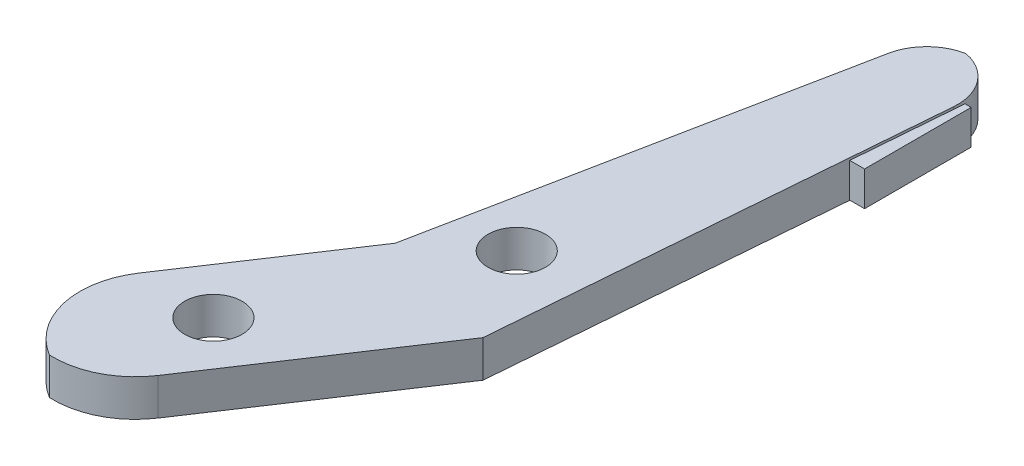
ISO-10303-21;
HEADER;
FILE_DESCRIPTION(('STEP AP214'),'2;1');
FILE_NAME('part.step','',(''),(''),'','','');
FILE_SCHEMA(('AUTOMOTIVE_DESIGN { 1 0 10303 214 1 1 1 1 }'));
ENDSEC;
DATA;
#1=APPLICATION_CONTEXT('core data for automotive mechanical design processes');
#2=APPLICATION_PROTOCOL_DEFINITION('international standard','automotive_design',2000,#1);
#3=PRODUCT_CONTEXT('',#1,'mechanical');
#4=PRODUCT('Part','Part','',(#3));
#5=PRODUCT_RELATED_PRODUCT_CATEGORY('part','',(#4));
#6=PRODUCT_DEFINITION_FORMATION('','',#4);
#7=PRODUCT_DEFINITION_CONTEXT('part definition',#1,'design');
#8=PRODUCT_DEFINITION('design','',#6,#7);
#9=PRODUCT_DEFINITION_SHAPE('','',#8);
#10=(LENGTH_UNIT() NAMED_UNIT(*) SI_UNIT(.MILLI.,.METRE.));
#11=(NAMED_UNIT(*) PLANE_ANGLE_UNIT() SI_UNIT($,.RADIAN.));
#12=(NAMED_UNIT(*) SI_UNIT($,.STERADIAN.) SOLID_ANGLE_UNIT());
#13=UNCERTAINTY_MEASURE_WITH_UNIT(LENGTH_MEASURE(1.E-05),#10,'distance_accuracy_value','');
#14=(GEOMETRIC_REPRESENTATION_CONTEXT(3) GLOBAL_UNCERTAINTY_ASSIGNED_CONTEXT((#13)) GLOBAL_UNIT_ASSIGNED_CONTEXT((#10,
#11,#12)) REPRESENTATION_CONTEXT('',''));
#15=CARTESIAN_POINT('',(0.,0.,0.));
#16=DIRECTION('',(0.,0.,1.));
#17=DIRECTION('',(1.,0.,0.));
#18=AXIS2_PLACEMENT_3D('',#15,#16,#17);
#19=CARTESIAN_POINT('',(17.6175711000441,2.25,-12.6861928974152));
#20=DIRECTION('',(-0.833038122021202,0.,-0.553215588409608));
#21=DIRECTION('',(-0.553215588409608,0.,0.833038122021202));
#22=AXIS2_PLACEMENT_3D('',#19,#20,#21);
#23=PLANE('',#22);
#24=DIRECTION('',(0.553215588409608,0.,-0.833038122021202));
#25=VECTOR('',#24,1.);
#26=CARTESIAN_POINT('',(17.6175711000441,2.25,-12.6861928974152));
#27=LINE('',#26,#25);
#28=CARTESIAN_POINT('',(9.71336089928782,2.25,-0.783946179046166));
#29=VERTEX_POINT('',#28);
#30=CARTESIAN_POINT('',(17.6175711000441,2.25,-12.6861928974152));
#31=VERTEX_POINT('',#30);
#32=EDGE_CURVE('E184',#29,#31,#27,.T.);
#33=ORIENTED_EDGE('',*,*,#32,.F.);
#34=DIRECTION('',(0.,-1.,0.));
#35=VECTOR('',#34,1.);
#36=CARTESIAN_POINT('',(9.71336089928782,2.25,-0.783946179046166));
#37=LINE('',#36,#35);
#38=CARTESIAN_POINT('',(9.71336089928782,0.,-0.783946179046166));
#39=VERTEX_POINT('',#38);
#40=EDGE_CURVE('E211',#29,#39,#37,.T.);
#41=ORIENTED_EDGE('',*,*,#40,.T.);
#42=DIRECTION('',(0.553215588409608,0.,-0.833038122021202));
#43=VECTOR('',#42,1.);
#44=CARTESIAN_POINT('',(17.6175711000441,0.,-12.6861928974152));
#45=LINE('',#44,#43);
#46=CARTESIAN_POINT('',(17.6175711000441,0.,-12.6861928974152));
#47=VERTEX_POINT('',#46);
#48=EDGE_CURVE('E196',#39,#47,#45,.T.);
#49=ORIENTED_EDGE('',*,*,#48,.T.);
#50=DIRECTION('',(0.,-1.,0.));
#51=VECTOR('',#50,1.);
#52=CARTESIAN_POINT('',(17.6175711000441,2.25,-12.6861928974152));
#53=LINE('',#52,#51);
#54=EDGE_CURVE('E208',#31,#47,#53,.T.);
#55=ORIENTED_EDGE('',*,*,#54,.F.);
#56=EDGE_LOOP('',(#33,#41,#49,#55));
#57=FACE_BOUND('',#56,.T.);
#58=ADVANCED_FACE('F33',(#57),#23,.F.);
#59=CARTESIAN_POINT('',(17.6175711000441,2.25,-12.6861928974152));
#60=DIRECTION('',(-0.996721205714873,0.,-0.0809125335055623));
#61=DIRECTION('',(-0.0809125335055623,0.,0.996721205714874));
#62=AXIS2_PLACEMENT_3D('',#59,#60,#61);
#63=PLANE('',#62);
#64=DIRECTION('',(0.,-1.,0.));
#65=VECTOR('',#64,1.);
#66=CARTESIAN_POINT('',(19.2958742147274,2.1072170473523,-33.3603731702058));
#67=LINE('',#66,#65);
#68=CARTESIAN_POINT('',(19.2958742147274,2.1072170473523,-33.3603731702058));
#69=VERTEX_POINT('',#68);
#70=CARTESIAN_POINT('',(19.2958742147274,0.00721704735230167,-33.3603731702058));
#71=VERTEX_POINT('',#70);
#72=EDGE_CURVE('E50',#69,#71,#67,.T.);
#73=ORIENTED_EDGE('',*,*,#72,.F.);
#74=DIRECTION('',(-0.0809125335055623,0.,0.996721205714874));
#75=VECTOR('',#74,1.);
#76=CARTESIAN_POINT('',(19.7770147397811,2.1072170473523,-39.2873036897751));
#77=LINE('',#76,#75);
#78=CARTESIAN_POINT('',(19.7706742282053,2.1072170473523,-39.2091980852555));
#79=VERTEX_POINT('',#78);
#80=EDGE_CURVE('E156',#79,#69,#77,.T.);
#81=ORIENTED_EDGE('',*,*,#80,.F.);
#82=DIRECTION('',(0.,-1.,0.));
#83=VECTOR('',#82,1.);
#84=CARTESIAN_POINT('',(19.7706742282053,2.25,-39.2091980852555));
#85=LINE('',#84,#83);
#86=CARTESIAN_POINT('',(19.7706742282053,2.25,-39.2091980852555));
#87=VERTEX_POINT('',#86);
#88=EDGE_CURVE('E43',#79,#87,#85,.F.);
#89=ORIENTED_EDGE('',*,*,#88,.T.);
#90=DIRECTION('',(0.0809125335055623,0.,-0.996721205714874));
#91=VECTOR('',#90,1.);
#92=CARTESIAN_POINT('',(17.6175711000441,2.25,-12.6861928974152));
#93=LINE('',#92,#91);
#94=EDGE_CURVE('E186',#31,#87,#93,.T.);
#95=ORIENTED_EDGE('',*,*,#94,.F.);
#96=ORIENTED_EDGE('',*,*,#54,.T.);
#97=DIRECTION('',(0.0809125335055623,0.,-0.996721205714874));
#98=VECTOR('',#97,1.);
#99=CARTESIAN_POINT('',(17.6175711000441,0.,-12.6861928974152));
#100=LINE('',#99,#98);
#101=CARTESIAN_POINT('',(19.7706742282053,0.,-39.2091980852555));
#102=VERTEX_POINT('',#101);
#103=EDGE_CURVE('E198',#47,#102,#100,.T.);
#104=ORIENTED_EDGE('',*,*,#103,.T.);
#105=CARTESIAN_POINT('',(19.7706742282053,0.00721704735230167,-39.2091980852555));
#106=VERTEX_POINT('',#105);
#107=EDGE_CURVE('E11',#102,#106,#85,.F.);
#108=ORIENTED_EDGE('',*,*,#107,.T.);
#109=DIRECTION('',(0.0809125335055623,0.,-0.996721205714874));
#110=VECTOR('',#109,1.);
#111=CARTESIAN_POINT('',(19.7770147397811,0.00721704735230167,-39.2873036897752));
#112=LINE('',#111,#110);
#113=EDGE_CURVE('E54',#71,#106,#112,.T.);
#114=ORIENTED_EDGE('',*,*,#113,.F.);
#115=EDGE_LOOP('',(#73,#81,#89,#95,#96,#104,#108,#114));
#116=FACE_BOUND('',#115,.T.);
#117=ADVANCED_FACE('F259',(#116),#63,.F.);
#118=CARTESIAN_POINT('',(9.95788059137295,2.25,-14.9946861963816));
#119=DIRECTION('',(0.980616053192521,0.,0.195939164592286));
#120=DIRECTION('',(0.195939164592286,0.,-0.980616053192521));
#121=AXIS2_PLACEMENT_3D('',#118,#119,#120);
#122=PLANE('',#121);
#123=DIRECTION('',(-0.195939164592286,0.,0.980616053192521));
#124=VECTOR('',#123,1.);
#125=CARTESIAN_POINT('',(9.95788059137295,2.25,-14.9946861963816));
#126=LINE('',#125,#124);
#127=CARTESIAN_POINT('',(14.9621934270269,2.25,-40.0397531795491));
#128=VERTEX_POINT('',#127);
#129=CARTESIAN_POINT('',(9.95788059137295,2.25,-14.9946861963816));
#130=VERTEX_POINT('',#129);
#131=EDGE_CURVE('E190',#128,#130,#126,.T.);
#132=ORIENTED_EDGE('',*,*,#131,.F.);
#133=DIRECTION('',(0.,-1.,0.));
#134=VECTOR('',#133,1.);
#135=CARTESIAN_POINT('',(14.9621934270269,2.25,-40.0397531795491));
#136=LINE('',#135,#134);
#137=CARTESIAN_POINT('',(14.9621934270269,0.,-40.0397531795491));
#138=VERTEX_POINT('',#137);
#139=EDGE_CURVE('E224',#128,#138,#136,.T.);
#140=ORIENTED_EDGE('',*,*,#139,.T.);
#141=DIRECTION('',(-0.195939164592286,0.,0.980616053192521));
#142=VECTOR('',#141,1.);
#143=CARTESIAN_POINT('',(9.95788059137295,0.,-14.9946861963816));
#144=LINE('',#143,#142);
#145=CARTESIAN_POINT('',(9.95788059137295,0.,-14.9946861963816));
#146=VERTEX_POINT('',#145);
#147=EDGE_CURVE('E202',#138,#146,#144,.T.);
#148=ORIENTED_EDGE('',*,*,#147,.T.);
#149=DIRECTION('',(0.,-1.,0.));
#150=VECTOR('',#149,1.);
#151=CARTESIAN_POINT('',(9.95788059137295,2.25,-14.9946861963816));
#152=LINE('',#151,#150);
#153=EDGE_CURVE('E195',#130,#146,#152,.T.);
#154=ORIENTED_EDGE('',*,*,#153,.F.);
#155=EDGE_LOOP('',(#132,#140,#148,#154));
#156=FACE_BOUND('',#155,.T.);
#157=ADVANCED_FACE('F265',(#156),#122,.F.);
#158=CARTESIAN_POINT('',(0.,2.25,0.));
#159=DIRECTION('',(0.833038122021202,0.,0.553215588409608));
#160=DIRECTION('',(0.553215588409608,0.,-0.833038122021202));
#161=AXIS2_PLACEMENT_3D('',#158,#159,#160);
#162=PLANE('',#161);
#163=DIRECTION('',(-0.553215588409608,0.,0.833038122021202));
#164=VECTOR('',#163,1.);
#165=CARTESIAN_POINT('',(0.,0.,0.));
#166=LINE('',#165,#164);
#167=CARTESIAN_POINT('',(3.72561595884296,0.,-5.61007351699718));
#168=VERTEX_POINT('',#167);
#169=EDGE_CURVE('E187',#146,#168,#166,.T.);
#170=ORIENTED_EDGE('',*,*,#169,.T.);
#171=DIRECTION('',(0.,-1.,0.));
#172=VECTOR('',#171,1.);
#173=CARTESIAN_POINT('',(3.72561595884296,2.25,-5.61007351699718));
#174=LINE('',#173,#172);
#175=CARTESIAN_POINT('',(3.72561595884296,2.25,-5.61007351699718));
#176=VERTEX_POINT('',#175);
#177=EDGE_CURVE('E222',#168,#176,#174,.F.);
#178=ORIENTED_EDGE('',*,*,#177,.T.);
#179=DIRECTION('',(-0.553215588409608,0.,0.833038122021202));
#180=VECTOR('',#179,1.);
#181=CARTESIAN_POINT('',(0.,2.25,0.));
#182=LINE('',#181,#180);
#183=EDGE_CURVE('E192',#130,#176,#182,.T.);
#184=ORIENTED_EDGE('',*,*,#183,.F.);
#185=ORIENTED_EDGE('',*,*,#153,.T.);
#186=EDGE_LOOP('',(#170,#178,#184,#185));
#187=FACE_BOUND('',#186,.T.);
#188=ADVANCED_FACE('F301',(#187),#162,.F.);
#189=CARTESIAN_POINT('',(0.,2.25,0.));
#190=DIRECTION('',(0.,-1.,0.));
#191=DIRECTION('',(0.,0.,-1.));
#192=AXIS2_PLACEMENT_3D('',#189,#190,#191);
#193=PLANE('',#192);
#194=CARTESIAN_POINT('',(8.35332745413089,2.25,-5.51454370339277));
#195=DIRECTION('',(0.,1.,0.));
#196=DIRECTION('',(0.,0.,1.));
#197=AXIS2_PLACEMENT_3D('',#194,#195,#196);
#198=CIRCLE('',#197,1.75);
#199=CARTESIAN_POINT('',(8.35332745413089,2.25,-3.76454370339277));
#200=VERTEX_POINT('',#199);
#201=EDGE_CURVE('E176',#200,#200,#198,.T.);
#202=ORIENTED_EDGE('',*,*,#201,.F.);
#203=EDGE_LOOP('',(#202));
#204=FACE_BOUND('',#203,.T.);
#205=CARTESIAN_POINT('',(14.0600254717812,2.25,-18.2986587582312));
#206=DIRECTION('',(0.,1.,0.));
#207=DIRECTION('',(0.,0.,1.));
#208=AXIS2_PLACEMENT_3D('',#205,#206,#207);
#209=CIRCLE('',#208,1.75);
#210=CARTESIAN_POINT('',(14.0600254717812,2.25,-16.5486587582312));
#211=VERTEX_POINT('',#210);
#212=EDGE_CURVE('E172',#211,#211,#209,.T.);
#213=ORIENTED_EDGE('',*,*,#212,.F.);
#214=EDGE_LOOP('',(#213));
#215=FACE_BOUND('',#214,.T.);
#216=CARTESIAN_POINT('',(16.7805106110607,2.25,-39.4519356857722));
#217=DIRECTION('',(0.,-1.,0.));
#218=DIRECTION('',(0.,0.,-1.));
#219=AXIS2_PLACEMENT_3D('',#216,#217,#218);
#220=CIRCLE('',#219,3.);
#221=CARTESIAN_POINT('',(17.3422760988326,2.25,-42.3988696071129));
#222=VERTEX_POINT('',#221);
#223=EDGE_CURVE('E233',#87,#222,#220,.F.);
#224=ORIENTED_EDGE('',*,*,#223,.T.);
#225=CARTESIAN_POINT('',(17.9040415866045,2.25,-39.4519356857722));
#226=DIRECTION('',(0.,-1.,0.));
#227=DIRECTION('',(0.,0.,-1.));
#228=AXIS2_PLACEMENT_3D('',#225,#226,#227);
#229=CIRCLE('',#228,3.);
#230=EDGE_CURVE('E235',#222,#128,#229,.F.);
#231=ORIENTED_EDGE('',*,*,#230,.T.);
#232=ORIENTED_EDGE('',*,*,#131,.T.);
#233=ORIENTED_EDGE('',*,*,#183,.T.);
#234=CARTESIAN_POINT('',(7.89080656894897,2.25,-2.84399557494914));
#235=DIRECTION('',(0.,-1.,0.));
#236=DIRECTION('',(0.,0.,-1.));
#237=AXIS2_PLACEMENT_3D('',#234,#235,#236);
#238=CIRCLE('',#237,5.);
#239=CARTESIAN_POINT('',(5.32053283728908,2.25,1.44479130997988));
#240=VERTEX_POINT('',#239);
#241=EDGE_CURVE('E218',#176,#240,#238,.F.);
#242=ORIENTED_EDGE('',*,*,#241,.T.);
#243=CARTESIAN_POINT('',(5.54817028918182,2.25,-3.5500241210942));
#244=DIRECTION('',(0.,-1.,0.));
#245=DIRECTION('',(0.,0.,-1.));
#246=AXIS2_PLACEMENT_3D('',#243,#244,#245);
#247=CIRCLE('',#246,5.);
#248=EDGE_CURVE('E220',#240,#29,#247,.F.);
#249=ORIENTED_EDGE('',*,*,#248,.T.);
#250=ORIENTED_EDGE('',*,*,#32,.T.);
#251=ORIENTED_EDGE('',*,*,#94,.T.);
#252=EDGE_LOOP('',(#224,#231,#232,#233,#242,#249,#250,#251));
#253=FACE_BOUND('',#252,.T.);
#254=ADVANCED_FACE('F306',(#204,#215,#253),#193,.F.);
#255=CARTESIAN_POINT('',(0.,0.,0.));
#256=DIRECTION('',(0.,-1.,0.));
#257=DIRECTION('',(0.,0.,-1.));
#258=AXIS2_PLACEMENT_3D('',#255,#256,#257);
#259=PLANE('',#258);
#260=CARTESIAN_POINT('',(8.35332745413089,0.,-5.51454370339277));
#261=DIRECTION('',(0.,1.,0.));
#262=DIRECTION('',(0.,0.,1.));
#263=AXIS2_PLACEMENT_3D('',#260,#261,#262);
#264=CIRCLE('',#263,1.75);
#265=CARTESIAN_POINT('',(8.35332745413089,0.,-3.76454370339277));
#266=VERTEX_POINT('',#265);
#267=EDGE_CURVE('E173',#266,#266,#264,.T.);
#268=ORIENTED_EDGE('',*,*,#267,.T.);
#269=EDGE_LOOP('',(#268));
#270=FACE_BOUND('',#269,.T.);
#271=CARTESIAN_POINT('',(14.0600254717812,0.,-18.2986587582312));
#272=DIRECTION('',(0.,1.,0.));
#273=DIRECTION('',(0.,0.,1.));
#274=AXIS2_PLACEMENT_3D('',#271,#272,#273);
#275=CIRCLE('',#274,1.75);
#276=CARTESIAN_POINT('',(14.0600254717812,0.,-16.5486587582312));
#277=VERTEX_POINT('',#276);
#278=EDGE_CURVE('E179',#277,#277,#275,.T.);
#279=ORIENTED_EDGE('',*,*,#278,.T.);
#280=EDGE_LOOP('',(#279));
#281=FACE_BOUND('',#280,.T.);
#282=ORIENTED_EDGE('',*,*,#147,.F.);
#283=CARTESIAN_POINT('',(17.9040415866045,0.,-39.4519356857722));
#284=DIRECTION('',(0.,-1.,0.));
#285=DIRECTION('',(0.,0.,-1.));
#286=AXIS2_PLACEMENT_3D('',#283,#284,#285);
#287=CIRCLE('',#286,3.);
#288=CARTESIAN_POINT('',(17.3422760988326,0.,-42.3988696071129));
#289=VERTEX_POINT('',#288);
#290=EDGE_CURVE('E231',#138,#289,#287,.T.);
#291=ORIENTED_EDGE('',*,*,#290,.T.);
#292=CARTESIAN_POINT('',(16.7805106110607,0.,-39.4519356857722));
#293=DIRECTION('',(0.,-1.,0.));
#294=DIRECTION('',(0.,0.,-1.));
#295=AXIS2_PLACEMENT_3D('',#292,#293,#294);
#296=CIRCLE('',#295,3.);
#297=EDGE_CURVE('E229',#289,#102,#296,.T.);
#298=ORIENTED_EDGE('',*,*,#297,.T.);
#299=ORIENTED_EDGE('',*,*,#103,.F.);
#300=ORIENTED_EDGE('',*,*,#48,.F.);
#301=CARTESIAN_POINT('',(5.54817028918182,0.,-3.5500241210942));
#302=DIRECTION('',(0.,-1.,0.));
#303=DIRECTION('',(0.,0.,-1.));
#304=AXIS2_PLACEMENT_3D('',#301,#302,#303);
#305=CIRCLE('',#304,5.);
#306=CARTESIAN_POINT('',(5.32053283728908,0.,1.44479130997988));
#307=VERTEX_POINT('',#306);
#308=EDGE_CURVE('E216',#39,#307,#305,.T.);
#309=ORIENTED_EDGE('',*,*,#308,.T.);
#310=CARTESIAN_POINT('',(7.89080656894897,0.,-2.84399557494914));
#311=DIRECTION('',(0.,-1.,0.));
#312=DIRECTION('',(0.,0.,-1.));
#313=AXIS2_PLACEMENT_3D('',#310,#311,#312);
#314=CIRCLE('',#313,5.);
#315=EDGE_CURVE('E214',#307,#168,#314,.T.);
#316=ORIENTED_EDGE('',*,*,#315,.T.);
#317=ORIENTED_EDGE('',*,*,#169,.F.);
#318=EDGE_LOOP('',(#282,#291,#298,#299,#300,#309,#316,#317));
#319=FACE_BOUND('',#318,.T.);
#320=ADVANCED_FACE('F276',(#270,#281,#319),#259,.T.);
#321=CARTESIAN_POINT('',(7.89080656894897,2.25,-2.84399557494914));
#322=DIRECTION('',(0.,-1.,0.));
#323=DIRECTION('',(0.,0.,-1.));
#324=AXIS2_PLACEMENT_3D('',#321,#322,#323);
#325=CYLINDRICAL_SURFACE('',#324,5.);
#326=DIRECTION('',(0.,-1.,0.));
#327=VECTOR('',#326,1.);
#328=CARTESIAN_POINT('',(5.32053283728908,1.125,1.44479130997988));
#329=LINE('',#328,#327);
#330=EDGE_CURVE('E199',#240,#307,#329,.T.);
#331=ORIENTED_EDGE('',*,*,#330,.F.);
#332=ORIENTED_EDGE('',*,*,#241,.F.);
#333=ORIENTED_EDGE('',*,*,#177,.F.);
#334=ORIENTED_EDGE('',*,*,#315,.F.);
#335=EDGE_LOOP('',(#331,#332,#333,#334));
#336=FACE_BOUND('',#335,.T.);
#337=ADVANCED_FACE('F273',(#336),#325,.T.);
#338=CARTESIAN_POINT('',(5.54817028918182,2.25,-3.5500241210942));
#339=DIRECTION('',(0.,-1.,0.));
#340=DIRECTION('',(0.,0.,-1.));
#341=AXIS2_PLACEMENT_3D('',#338,#339,#340);
#342=CYLINDRICAL_SURFACE('',#341,5.);
#343=ORIENTED_EDGE('',*,*,#248,.F.);
#344=ORIENTED_EDGE('',*,*,#330,.T.);
#345=ORIENTED_EDGE('',*,*,#308,.F.);
#346=ORIENTED_EDGE('',*,*,#40,.F.);
#347=EDGE_LOOP('',(#343,#344,#345,#346));
#348=FACE_BOUND('',#347,.T.);
#349=ADVANCED_FACE('F270',(#348),#342,.T.);
#350=CARTESIAN_POINT('',(16.7805106110607,2.25,-39.4519356857722));
#351=DIRECTION('',(0.,-1.,0.));
#352=DIRECTION('',(0.,0.,-1.));
#353=AXIS2_PLACEMENT_3D('',#350,#351,#352);
#354=CYLINDRICAL_SURFACE('',#353,3.);
#355=DIRECTION('',(0.,-1.,0.));
#356=VECTOR('',#355,1.);
#357=CARTESIAN_POINT('',(17.3422760988326,1.125,-42.3988696071129));
#358=LINE('',#357,#356);
#359=EDGE_CURVE('E37',#222,#289,#358,.T.);
#360=ORIENTED_EDGE('',*,*,#359,.F.);
#361=ORIENTED_EDGE('',*,*,#223,.F.);
#362=ORIENTED_EDGE('',*,*,#88,.F.);
#363=EDGE_CURVE('E42',#106,#79,#85,.F.);
#364=ORIENTED_EDGE('',*,*,#363,.F.);
#365=ORIENTED_EDGE('',*,*,#107,.F.);
#366=ORIENTED_EDGE('',*,*,#297,.F.);
#367=EDGE_LOOP('',(#360,#361,#362,#364,#365,#366));
#368=FACE_BOUND('',#367,.T.);
#369=ADVANCED_FACE('F35',(#368),#354,.T.);
#370=CARTESIAN_POINT('',(17.9040415866045,2.25,-39.4519356857722));
#371=DIRECTION('',(0.,-1.,0.));
#372=DIRECTION('',(0.,0.,-1.));
#373=AXIS2_PLACEMENT_3D('',#370,#371,#372);
#374=CYLINDRICAL_SURFACE('',#373,3.);
#375=ORIENTED_EDGE('',*,*,#230,.F.);
#376=ORIENTED_EDGE('',*,*,#359,.T.);
#377=ORIENTED_EDGE('',*,*,#290,.F.);
#378=ORIENTED_EDGE('',*,*,#139,.F.);
#379=EDGE_LOOP('',(#375,#376,#377,#378));
#380=FACE_BOUND('',#379,.T.);
#381=ADVANCED_FACE('F278',(#380),#374,.T.);
#382=CARTESIAN_POINT('',(14.0600254717812,0.,-18.2986587582312));
#383=DIRECTION('',(0.,1.,0.));
#384=DIRECTION('',(0.,0.,1.));
#385=AXIS2_PLACEMENT_3D('',#382,#383,#384);
#386=CYLINDRICAL_SURFACE('',#385,1.75);
#387=ORIENTED_EDGE('',*,*,#278,.F.);
#388=EDGE_LOOP('',(#387));
#389=FACE_BOUND('',#388,.T.);
#390=ORIENTED_EDGE('',*,*,#212,.T.);
#391=EDGE_LOOP('',(#390));
#392=FACE_BOUND('',#391,.T.);
#393=ADVANCED_FACE('F280',(#389,#392),#386,.F.);
#394=CARTESIAN_POINT('',(8.35332745413089,0.,-5.51454370339277));
#395=DIRECTION('',(0.,1.,0.));
#396=DIRECTION('',(0.,0.,1.));
#397=AXIS2_PLACEMENT_3D('',#394,#395,#396);
#398=CYLINDRICAL_SURFACE('',#397,1.75);
#399=ORIENTED_EDGE('',*,*,#267,.F.);
#400=EDGE_LOOP('',(#399));
#401=FACE_BOUND('',#400,.T.);
#402=ORIENTED_EDGE('',*,*,#201,.T.);
#403=EDGE_LOOP('',(#402));
#404=FACE_BOUND('',#403,.T.);
#405=ADVANCED_FACE('F286',(#401,#404),#398,.F.);
#406=CARTESIAN_POINT('',(17.6175711000441,2.25,-12.6861928974152));
#407=DIRECTION('',(-0.996721205714873,0.,-0.0809125335055623));
#408=DIRECTION('',(-0.0809125335055623,0.,0.996721205714874));
#409=AXIS2_PLACEMENT_3D('',#406,#407,#408);
#410=PLANE('',#409);
#411=CARTESIAN_POINT('',(19.8235357762259,0.00721704735230167,-39.8603731702058));
#412=VERTEX_POINT('',#411);
#413=EDGE_CURVE('E136',#106,#412,#112,.T.);
#414=ORIENTED_EDGE('',*,*,#413,.F.);
#415=ORIENTED_EDGE('',*,*,#363,.T.);
#416=CARTESIAN_POINT('',(19.8235357762259,2.1072170473523,-39.8603731702058));
#417=VERTEX_POINT('',#416);
#418=EDGE_CURVE('E158',#417,#79,#77,.T.);
#419=ORIENTED_EDGE('',*,*,#418,.F.);
#420=DIRECTION('',(0.,1.,0.));
#421=VECTOR('',#420,1.);
#422=CARTESIAN_POINT('',(19.8235357762259,2.10721704735231,-39.8603731702058));
#423=LINE('',#422,#421);
#424=EDGE_CURVE('E140',#412,#417,#423,.T.);
#425=ORIENTED_EDGE('',*,*,#424,.F.);
#426=EDGE_LOOP('',(#414,#415,#419,#425));
#427=FACE_BOUND('',#426,.T.);
#428=ADVANCED_FACE('F242',(#427),#410,.T.);
#429=CARTESIAN_POINT('',(20.2,0.,0.));
#430=DIRECTION('',(-1.,0.,0.));
#431=DIRECTION('',(0.,0.,1.));
#432=AXIS2_PLACEMENT_3D('',#429,#430,#431);
#433=PLANE('',#432);
#434=DIRECTION('',(0.,1.,0.));
#435=VECTOR('',#434,1.);
#436=CARTESIAN_POINT('',(20.2,2.1072170473523,-39.8603731702058));
#437=LINE('',#436,#435);
#438=CARTESIAN_POINT('',(20.2,0.00721704735230167,-39.8603731702058));
#439=VERTEX_POINT('',#438);
#440=CARTESIAN_POINT('',(20.2,2.1072170473523,-39.8603731702058));
#441=VERTEX_POINT('',#440);
#442=EDGE_CURVE('E143',#439,#441,#437,.T.);
#443=ORIENTED_EDGE('',*,*,#442,.T.);
#444=DIRECTION('',(0.,0.,1.));
#445=VECTOR('',#444,1.);
#446=CARTESIAN_POINT('',(20.2,2.1072170473523,-39.8603731702058));
#447=LINE('',#446,#445);
#448=CARTESIAN_POINT('',(20.2,2.1072170473523,-33.3603731702058));
#449=VERTEX_POINT('',#448);
#450=EDGE_CURVE('E150',#441,#449,#447,.T.);
#451=ORIENTED_EDGE('',*,*,#450,.T.);
#452=DIRECTION('',(0.,-1.,0.));
#453=VECTOR('',#452,1.);
#454=CARTESIAN_POINT('',(20.2,2.1072170473523,-33.3603731702058));
#455=LINE('',#454,#453);
#456=CARTESIAN_POINT('',(20.2,0.00721704735230167,-33.3603731702058));
#457=VERTEX_POINT('',#456);
#458=EDGE_CURVE('E155',#449,#457,#455,.T.);
#459=ORIENTED_EDGE('',*,*,#458,.T.);
#460=DIRECTION('',(0.,0.,-1.));
#461=VECTOR('',#460,1.);
#462=CARTESIAN_POINT('',(20.2,0.00721704735230167,-39.8603731702058));
#463=LINE('',#462,#461);
#464=EDGE_CURVE('E134',#457,#439,#463,.T.);
#465=ORIENTED_EDGE('',*,*,#464,.T.);
#466=EDGE_LOOP('',(#443,#451,#459,#465));
#467=FACE_BOUND('',#466,.T.);
#468=ADVANCED_FACE('F153',(#467),#433,.F.);
#469=CARTESIAN_POINT('',(12.7176571996546,2.1072170473523,-39.8603731702058));
#470=DIRECTION('',(0.,1.,0.));
#471=DIRECTION('',(0.,0.,1.));
#472=AXIS2_PLACEMENT_3D('',#469,#470,#471);
#473=PLANE('',#472);
#474=DIRECTION('',(1.,0.,0.));
#475=VECTOR('',#474,1.);
#476=CARTESIAN_POINT('',(12.7176571996546,2.1072170473523,-39.8603731702058));
#477=LINE('',#476,#475);
#478=EDGE_CURVE('E146',#417,#441,#477,.T.);
#479=ORIENTED_EDGE('',*,*,#478,.F.);
#480=ORIENTED_EDGE('',*,*,#418,.T.);
#481=ORIENTED_EDGE('',*,*,#80,.T.);
#482=DIRECTION('',(1.,0.,0.));
#483=VECTOR('',#482,1.);
#484=CARTESIAN_POINT('',(12.7176571996546,2.1072170473523,-33.3603731702058));
#485=LINE('',#484,#483);
#486=EDGE_CURVE('E164',#69,#449,#485,.T.);
#487=ORIENTED_EDGE('',*,*,#486,.T.);
#488=ORIENTED_EDGE('',*,*,#450,.F.);
#489=EDGE_LOOP('',(#479,#480,#481,#487,#488));
#490=FACE_BOUND('',#489,.T.);
#491=ADVANCED_FACE('F246',(#490),#473,.T.);
#492=CARTESIAN_POINT('',(12.7176571996546,2.1072170473523,-33.3603731702058));
#493=DIRECTION('',(0.,0.,1.));
#494=DIRECTION('',(1.,0.,0.));
#495=AXIS2_PLACEMENT_3D('',#492,#493,#494);
#496=PLANE('',#495);
#497=ORIENTED_EDGE('',*,*,#486,.F.);
#498=ORIENTED_EDGE('',*,*,#72,.T.);
#499=DIRECTION('',(1.,0.,0.));
#500=VECTOR('',#499,1.);
#501=CARTESIAN_POINT('',(12.7176571996546,0.00721704735230167,-33.3603731702058));
#502=LINE('',#501,#500);
#503=EDGE_CURVE('E167',#71,#457,#502,.T.);
#504=ORIENTED_EDGE('',*,*,#503,.T.);
#505=ORIENTED_EDGE('',*,*,#458,.F.);
#506=EDGE_LOOP('',(#497,#498,#504,#505));
#507=FACE_BOUND('',#506,.T.);
#508=ADVANCED_FACE('F249',(#507),#496,.T.);
#509=CARTESIAN_POINT('',(12.7176571996546,0.00721704735230167,-39.8603731702058));
#510=DIRECTION('',(0.,-1.,0.));
#511=DIRECTION('',(0.,0.,-1.));
#512=AXIS2_PLACEMENT_3D('',#509,#510,#511);
#513=PLANE('',#512);
#514=ORIENTED_EDGE('',*,*,#503,.F.);
#515=ORIENTED_EDGE('',*,*,#113,.T.);
#516=ORIENTED_EDGE('',*,*,#413,.T.);
#517=DIRECTION('',(1.,0.,0.));
#518=VECTOR('',#517,1.);
#519=CARTESIAN_POINT('',(12.7176571996546,0.00721704735230167,-39.8603731702058));
#520=LINE('',#519,#518);
#521=EDGE_CURVE('E130',#412,#439,#520,.T.);
#522=ORIENTED_EDGE('',*,*,#521,.T.);
#523=ORIENTED_EDGE('',*,*,#464,.F.);
#524=EDGE_LOOP('',(#514,#515,#516,#522,#523));
#525=FACE_BOUND('',#524,.T.);
#526=ADVANCED_FACE('F132',(#525),#513,.T.);
#527=CARTESIAN_POINT('',(12.7176571996546,2.1072170473523,-39.8603731702058));
#528=DIRECTION('',(0.,0.,-1.));
#529=DIRECTION('',(0.,1.,0.));
#530=AXIS2_PLACEMENT_3D('',#527,#528,#529);
#531=PLANE('',#530);
#532=ORIENTED_EDGE('',*,*,#521,.F.);
#533=ORIENTED_EDGE('',*,*,#424,.T.);
#534=ORIENTED_EDGE('',*,*,#478,.T.);
#535=ORIENTED_EDGE('',*,*,#442,.F.);
#536=EDGE_LOOP('',(#532,#533,#534,#535));
#537=FACE_BOUND('',#536,.T.);
#538=ADVANCED_FACE('F144',(#537),#531,.T.);
#539=CLOSED_SHELL('',(#58,#117,#157,#188,#254,#320,#337,#349,#369,#381,#393,#405,#428,#468,#491,
#508,#526,#538));
#540=MANIFOLD_SOLID_BREP('B2',#539);
#541=ADVANCED_BREP_SHAPE_REPRESENTATION('',(#18,#540),#14);
#542=SHAPE_DEFINITION_REPRESENTATION(#9,#541);
ENDSEC;
END-ISO-10303-21;
